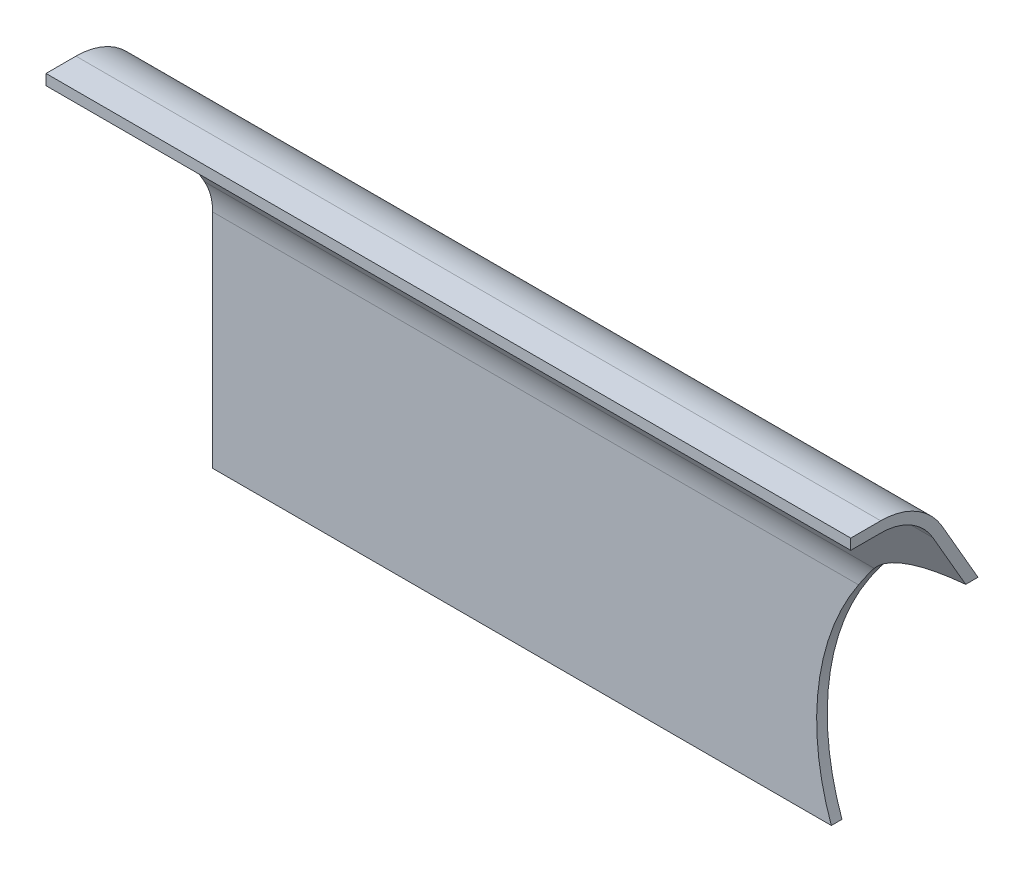
ISO-10303-21;
HEADER;
FILE_DESCRIPTION(('STEP AP214'),'2;1');
FILE_NAME('part.step','',(''),(''),'','','');
FILE_SCHEMA(('AUTOMOTIVE_DESIGN { 1 0 10303 214 1 1 1 1 }'));
ENDSEC;
DATA;
#1=APPLICATION_CONTEXT('core data for automotive mechanical design processes');
#2=APPLICATION_PROTOCOL_DEFINITION('international standard','automotive_design',2000,#1);
#3=PRODUCT_CONTEXT('',#1,'mechanical');
#4=PRODUCT('Part','Part','',(#3));
#5=PRODUCT_RELATED_PRODUCT_CATEGORY('part','',(#4));
#6=PRODUCT_DEFINITION_FORMATION('','',#4);
#7=PRODUCT_DEFINITION_CONTEXT('part definition',#1,'design');
#8=PRODUCT_DEFINITION('design','',#6,#7);
#9=PRODUCT_DEFINITION_SHAPE('','',#8);
#10=(LENGTH_UNIT() NAMED_UNIT(*) SI_UNIT(.MILLI.,.METRE.));
#11=(NAMED_UNIT(*) PLANE_ANGLE_UNIT() SI_UNIT($,.RADIAN.));
#12=(NAMED_UNIT(*) SI_UNIT($,.STERADIAN.) SOLID_ANGLE_UNIT());
#13=UNCERTAINTY_MEASURE_WITH_UNIT(LENGTH_MEASURE(1.E-05),#10,'distance_accuracy_value','');
#14=(GEOMETRIC_REPRESENTATION_CONTEXT(3) GLOBAL_UNCERTAINTY_ASSIGNED_CONTEXT((#13)) GLOBAL_UNIT_ASSIGNED_CONTEXT((#10,
#11,#12)) REPRESENTATION_CONTEXT('',''));
#15=CARTESIAN_POINT('',(0.,0.,0.));
#16=DIRECTION('',(0.,0.,1.));
#17=DIRECTION('',(1.,0.,0.));
#18=AXIS2_PLACEMENT_3D('',#15,#16,#17);
#19=CARTESIAN_POINT('',(113.5,68.,-3.));
#20=DIRECTION('',(0.,0.,1.));
#21=DIRECTION('',(0.,1.,0.));
#22=AXIS2_PLACEMENT_3D('',#19,#20,#21);
#23=PLANE('',#22);
#24=CARTESIAN_POINT('',(126.88,23.7215242270664,-3.));
#25=DIRECTION('',(0.,0.,1.));
#26=DIRECTION('',(1.,0.,0.));
#27=AXIS2_PLACEMENT_3D('',#24,#25,#26);
#28=CIRCLE('',#27,70.);
#29=CARTESIAN_POINT('',(68.6968998045525,62.6410161513776,-3.));
#30=VERTEX_POINT('',#29);
#31=CARTESIAN_POINT('',(61.0219003588419,0.,-3.));
#32=VERTEX_POINT('',#31);
#33=EDGE_CURVE('E163',#30,#32,#28,.T.);
#34=ORIENTED_EDGE('',*,*,#33,.T.);
#35=DIRECTION('',(-1.,0.,0.));
#36=VECTOR('',#35,1.);
#37=CARTESIAN_POINT('',(113.5,0.,-3.));
#38=LINE('',#37,#36);
#39=CARTESIAN_POINT('',(-113.5,0.,-3.));
#40=VERTEX_POINT('',#39);
#41=EDGE_CURVE('E305',#32,#40,#38,.T.);
#42=ORIENTED_EDGE('',*,*,#41,.T.);
#43=DIRECTION('',(0.,-1.,0.));
#44=VECTOR('',#43,1.);
#45=CARTESIAN_POINT('',(-113.5,68.,-3.));
#46=LINE('',#45,#44);
#47=CARTESIAN_POINT('',(-113.5,62.6410161513776,-3.));
#48=VERTEX_POINT('',#47);
#49=EDGE_CURVE('E168',#48,#40,#46,.T.);
#50=ORIENTED_EDGE('',*,*,#49,.F.);
#51=DIRECTION('',(-1.,0.,0.));
#52=VECTOR('',#51,1.);
#53=CARTESIAN_POINT('',(113.5,62.6410161513776,-3.));
#54=LINE('',#53,#52);
#55=EDGE_CURVE('E148',#30,#48,#54,.T.);
#56=ORIENTED_EDGE('',*,*,#55,.F.);
#57=EDGE_LOOP('',(#34,#42,#50,#56));
#58=FACE_BOUND('',#57,.T.);
#59=ADVANCED_FACE('F50',(#58),#23,.F.);
#60=CARTESIAN_POINT('',(113.5,0.,-3.));
#61=DIRECTION('',(0.,1.,0.));
#62=DIRECTION('',(0.,0.,-1.));
#63=AXIS2_PLACEMENT_3D('',#60,#61,#62);
#64=PLANE('',#63);
#65=DIRECTION('',(-1.,0.,0.));
#66=VECTOR('',#65,1.);
#67=CARTESIAN_POINT('',(113.5,0.,0.));
#68=LINE('',#67,#66);
#69=CARTESIAN_POINT('',(61.0219003588419,0.,0.));
#70=VERTEX_POINT('',#69);
#71=CARTESIAN_POINT('',(-113.5,0.,0.));
#72=VERTEX_POINT('',#71);
#73=EDGE_CURVE('E170',#70,#72,#68,.T.);
#74=ORIENTED_EDGE('',*,*,#73,.T.);
#75=DIRECTION('',(0.,0.,1.));
#76=VECTOR('',#75,1.);
#77=CARTESIAN_POINT('',(-113.5,0.,-3.));
#78=LINE('',#77,#76);
#79=EDGE_CURVE('E156',#40,#72,#78,.T.);
#80=ORIENTED_EDGE('',*,*,#79,.F.);
#81=ORIENTED_EDGE('',*,*,#41,.F.);
#82=DIRECTION('',(0.,0.,-1.));
#83=VECTOR('',#82,1.);
#84=CARTESIAN_POINT('',(61.0219003588419,0.,46.9999999999999));
#85=LINE('',#84,#83);
#86=EDGE_CURVE('E171',#70,#32,#85,.T.);
#87=ORIENTED_EDGE('',*,*,#86,.F.);
#88=EDGE_LOOP('',(#74,#80,#81,#87));
#89=FACE_BOUND('',#88,.T.);
#90=ADVANCED_FACE('F206',(#89),#64,.F.);
#91=CARTESIAN_POINT('',(113.5,0.,0.));
#92=DIRECTION('',(0.,0.,-1.));
#93=DIRECTION('',(1.,0.,0.));
#94=AXIS2_PLACEMENT_3D('',#91,#92,#93);
#95=PLANE('',#94);
#96=DIRECTION('',(-1.,0.,0.));
#97=VECTOR('',#96,1.);
#98=CARTESIAN_POINT('',(113.5,62.6410161513776,0.));
#99=LINE('',#98,#97);
#100=CARTESIAN_POINT('',(-113.5,62.6410161513776,0.));
#101=VERTEX_POINT('',#100);
#102=CARTESIAN_POINT('',(68.6968998045525,62.6410161513776,0.));
#103=VERTEX_POINT('',#102);
#104=EDGE_CURVE('E248',#101,#103,#99,.F.);
#105=ORIENTED_EDGE('',*,*,#104,.F.);
#106=DIRECTION('',(0.,1.,0.));
#107=VECTOR('',#106,1.);
#108=CARTESIAN_POINT('',(-113.5,0.,0.));
#109=LINE('',#108,#107);
#110=EDGE_CURVE('E252',#72,#101,#109,.T.);
#111=ORIENTED_EDGE('',*,*,#110,.F.);
#112=ORIENTED_EDGE('',*,*,#73,.F.);
#113=CARTESIAN_POINT('',(126.88,23.7215242270664,0.));
#114=DIRECTION('',(0.,0.,1.));
#115=DIRECTION('',(1.,0.,0.));
#116=AXIS2_PLACEMENT_3D('',#113,#114,#115);
#117=CIRCLE('',#116,70.);
#118=EDGE_CURVE('E177',#103,#70,#117,.T.);
#119=ORIENTED_EDGE('',*,*,#118,.F.);
#120=EDGE_LOOP('',(#105,#111,#112,#119));
#121=FACE_BOUND('',#120,.T.);
#122=ADVANCED_FACE('F221',(#121),#95,.F.);
#123=CARTESIAN_POINT('',(113.5,67.1961524227066,0.));
#124=DIRECTION('',(0.,0.499999999999998,-0.86602540378444));
#125=DIRECTION('',(0.,-0.86602540378444,-0.499999999999998));
#126=AXIS2_PLACEMENT_3D('',#123,#124,#125);
#127=PLANE('',#126);
#128=DIRECTION('',(0.,0.86602540378444,0.499999999999998));
#129=VECTOR('',#128,1.);
#130=CARTESIAN_POINT('',(113.5,67.1961524227066,0.));
#131=LINE('',#130,#129);
#132=CARTESIAN_POINT('',(113.5,92.4308802129873,14.5692768826454));
#133=VERTEX_POINT('',#132);
#134=CARTESIAN_POINT('',(113.5,108.461524227066,23.8245735194569));
#135=VERTEX_POINT('',#134);
#136=EDGE_CURVE('E196',#133,#135,#131,.T.);
#137=ORIENTED_EDGE('',*,*,#136,.T.);
#138=DIRECTION('',(-1.,0.,0.));
#139=VECTOR('',#138,1.);
#140=CARTESIAN_POINT('',(113.5,108.461524227066,23.8245735194569));
#141=LINE('',#140,#139);
#142=CARTESIAN_POINT('',(-113.5,108.461524227066,23.8245735194569));
#143=VERTEX_POINT('',#142);
#144=EDGE_CURVE('E270',#143,#135,#141,.F.);
#145=ORIENTED_EDGE('',*,*,#144,.F.);
#146=DIRECTION('',(0.,0.86602540378444,0.499999999999998));
#147=VECTOR('',#146,1.);
#148=CARTESIAN_POINT('',(-113.5,67.1961524227066,0.));
#149=LINE('',#148,#147);
#150=CARTESIAN_POINT('',(-113.5,71.1410161513775,2.27756813566452));
#151=VERTEX_POINT('',#150);
#152=EDGE_CURVE('E327',#151,#143,#149,.T.);
#153=ORIENTED_EDGE('',*,*,#152,.F.);
#154=DIRECTION('',(-1.,0.,0.));
#155=VECTOR('',#154,1.);
#156=CARTESIAN_POINT('',(-113.5,71.1410161513775,2.27756813566452));
#157=LINE('',#156,#155);
#158=CARTESIAN_POINT('',(75.3883328523907,71.1410161513775,2.27756813566452));
#159=VERTEX_POINT('',#158);
#160=EDGE_CURVE('E255',#159,#151,#157,.T.);
#161=ORIENTED_EDGE('',*,*,#160,.F.);
#162=CARTESIAN_POINT('',(126.88,23.7215242270664,-25.1000882916717));
#163=DIRECTION('',(0.,-0.499999999999998,0.86602540378444));
#164=DIRECTION('',(0.,-0.86602540378444,-0.499999999999998));
#165=AXIS2_PLACEMENT_3D('',#162,#163,#164);
#166=ELLIPSE('',#165,80.8290376865475,70.);
#167=EDGE_CURVE('E176',#133,#159,#166,.T.);
#168=ORIENTED_EDGE('',*,*,#167,.F.);
#169=EDGE_LOOP('',(#137,#145,#153,#161,#168));
#170=FACE_BOUND('',#169,.T.);
#171=ADVANCED_FACE('F241',(#170),#127,.F.);
#172=CARTESIAN_POINT('',(113.5,116.961524227066,28.7320508075687));
#173=DIRECTION('',(0.,1.,0.));
#174=DIRECTION('',(0.,0.,-1.));
#175=AXIS2_PLACEMENT_3D('',#172,#173,#174);
#176=PLANE('',#175);
#177=DIRECTION('',(0.,0.,1.));
#178=VECTOR('',#177,1.);
#179=CARTESIAN_POINT('',(113.5,116.961524227066,28.7320508075687));
#180=LINE('',#179,#178);
#181=CARTESIAN_POINT('',(113.5,116.961524227066,38.5470053837924));
#182=VERTEX_POINT('',#181);
#183=CARTESIAN_POINT('',(113.5,116.961524227066,46.9999999999999));
#184=VERTEX_POINT('',#183);
#185=EDGE_CURVE('E343',#182,#184,#180,.T.);
#186=ORIENTED_EDGE('',*,*,#185,.T.);
#187=DIRECTION('',(-1.,0.,0.));
#188=VECTOR('',#187,1.);
#189=CARTESIAN_POINT('',(113.5,116.961524227066,46.9999999999999));
#190=LINE('',#189,#188);
#191=CARTESIAN_POINT('',(-113.5,116.961524227066,46.9999999999999));
#192=VERTEX_POINT('',#191);
#193=EDGE_CURVE('E296',#184,#192,#190,.T.);
#194=ORIENTED_EDGE('',*,*,#193,.T.);
#195=DIRECTION('',(0.,0.,1.));
#196=VECTOR('',#195,1.);
#197=CARTESIAN_POINT('',(-113.5,116.961524227066,28.7320508075687));
#198=LINE('',#197,#196);
#199=CARTESIAN_POINT('',(-113.5,116.961524227066,38.5470053837924));
#200=VERTEX_POINT('',#199);
#201=EDGE_CURVE('E325',#200,#192,#198,.T.);
#202=ORIENTED_EDGE('',*,*,#201,.F.);
#203=DIRECTION('',(-1.,0.,0.));
#204=VECTOR('',#203,1.);
#205=CARTESIAN_POINT('',(-113.5,116.961524227066,38.5470053837924));
#206=LINE('',#205,#204);
#207=EDGE_CURVE('E271',#182,#200,#206,.T.);
#208=ORIENTED_EDGE('',*,*,#207,.F.);
#209=EDGE_LOOP('',(#186,#194,#202,#208));
#210=FACE_BOUND('',#209,.T.);
#211=ADVANCED_FACE('F240',(#210),#176,.F.);
#212=CARTESIAN_POINT('',(113.5,116.961524227066,46.9999999999999));
#213=DIRECTION('',(0.,0.,-1.));
#214=DIRECTION('',(0.,-1.,0.));
#215=AXIS2_PLACEMENT_3D('',#212,#213,#214);
#216=PLANE('',#215);
#217=DIRECTION('',(0.,1.,0.));
#218=VECTOR('',#217,1.);
#219=CARTESIAN_POINT('',(-113.5,116.961524227066,46.9999999999999));
#220=LINE('',#219,#218);
#221=CARTESIAN_POINT('',(-113.5,119.961524227066,46.9999999999999));
#222=VERTEX_POINT('',#221);
#223=EDGE_CURVE('E318',#192,#222,#220,.T.);
#224=ORIENTED_EDGE('',*,*,#223,.F.);
#225=ORIENTED_EDGE('',*,*,#193,.F.);
#226=DIRECTION('',(0.,1.,0.));
#227=VECTOR('',#226,1.);
#228=CARTESIAN_POINT('',(113.5,116.961524227066,46.9999999999999));
#229=LINE('',#228,#227);
#230=CARTESIAN_POINT('',(113.5,119.961524227066,46.9999999999999));
#231=VERTEX_POINT('',#230);
#232=EDGE_CURVE('E341',#184,#231,#229,.T.);
#233=ORIENTED_EDGE('',*,*,#232,.T.);
#234=DIRECTION('',(-1.,0.,0.));
#235=VECTOR('',#234,1.);
#236=CARTESIAN_POINT('',(113.5,119.961524227066,46.9999999999999));
#237=LINE('',#236,#235);
#238=EDGE_CURVE('E300',#231,#222,#237,.T.);
#239=ORIENTED_EDGE('',*,*,#238,.T.);
#240=EDGE_LOOP('',(#224,#225,#233,#239));
#241=FACE_BOUND('',#240,.T.);
#242=ADVANCED_FACE('F232',(#241),#216,.F.);
#243=CARTESIAN_POINT('',(113.5,119.961524227066,46.9999999999999));
#244=DIRECTION('',(0.,-1.,0.));
#245=DIRECTION('',(0.,0.,1.));
#246=AXIS2_PLACEMENT_3D('',#243,#244,#245);
#247=PLANE('',#246);
#248=DIRECTION('',(0.,0.,-1.));
#249=VECTOR('',#248,1.);
#250=CARTESIAN_POINT('',(-113.5,119.961524227066,46.9999999999999));
#251=LINE('',#250,#249);
#252=CARTESIAN_POINT('',(-113.5,119.961524227066,38.5470053837924));
#253=VERTEX_POINT('',#252);
#254=EDGE_CURVE('E312',#222,#253,#251,.T.);
#255=ORIENTED_EDGE('',*,*,#254,.F.);
#256=ORIENTED_EDGE('',*,*,#238,.F.);
#257=DIRECTION('',(0.,0.,-1.));
#258=VECTOR('',#257,1.);
#259=CARTESIAN_POINT('',(113.5,119.961524227066,46.9999999999999));
#260=LINE('',#259,#258);
#261=CARTESIAN_POINT('',(113.5,119.961524227066,38.5470053837924));
#262=VERTEX_POINT('',#261);
#263=EDGE_CURVE('E340',#231,#262,#260,.T.);
#264=ORIENTED_EDGE('',*,*,#263,.T.);
#265=DIRECTION('',(-1.,0.,0.));
#266=VECTOR('',#265,1.);
#267=CARTESIAN_POINT('',(113.5,119.961524227066,38.5470053837924));
#268=LINE('',#267,#266);
#269=EDGE_CURVE('E277',#253,#262,#268,.F.);
#270=ORIENTED_EDGE('',*,*,#269,.F.);
#271=EDGE_LOOP('',(#255,#256,#264,#270));
#272=FACE_BOUND('',#271,.T.);
#273=ADVANCED_FACE('F227',(#272),#247,.F.);
#274=CARTESIAN_POINT('',(113.5,119.961524227066,26.9999999999999));
#275=DIRECTION('',(0.,-0.499999999999998,0.86602540378444));
#276=DIRECTION('',(0.,0.86602540378444,0.499999999999998));
#277=AXIS2_PLACEMENT_3D('',#274,#275,#276);
#278=PLANE('',#277);
#279=DIRECTION('',(-1.,0.,0.));
#280=VECTOR('',#279,1.);
#281=CARTESIAN_POINT('',(113.5,72.6410161513775,-0.3205080756888));
#282=LINE('',#281,#280);
#283=CARTESIAN_POINT('',(-113.5,72.6410161513775,-0.320508075688803));
#284=VERTEX_POINT('',#283);
#285=CARTESIAN_POINT('',(76.811214216168,72.6410161513775,-0.3205080756888));
#286=VERTEX_POINT('',#285);
#287=EDGE_CURVE('E154',#284,#286,#282,.F.);
#288=ORIENTED_EDGE('',*,*,#287,.F.);
#289=DIRECTION('',(0.,-0.86602540378444,-0.499999999999998));
#290=VECTOR('',#289,1.);
#291=CARTESIAN_POINT('',(-113.5,119.961524227066,26.9999999999999));
#292=LINE('',#291,#290);
#293=CARTESIAN_POINT('',(-113.5,109.961524227066,21.2264973081036));
#294=VERTEX_POINT('',#293);
#295=EDGE_CURVE('E307',#294,#284,#292,.T.);
#296=ORIENTED_EDGE('',*,*,#295,.F.);
#297=DIRECTION('',(-1.,0.,0.));
#298=VECTOR('',#297,1.);
#299=CARTESIAN_POINT('',(113.5,109.961524227066,21.2264973081036));
#300=LINE('',#299,#298);
#301=CARTESIAN_POINT('',(113.5,109.961524227066,21.2264973081036));
#302=VERTEX_POINT('',#301);
#303=EDGE_CURVE('E283',#302,#294,#300,.T.);
#304=ORIENTED_EDGE('',*,*,#303,.F.);
#305=DIRECTION('',(0.,-0.86602540378444,-0.499999999999998));
#306=VECTOR('',#305,1.);
#307=CARTESIAN_POINT('',(113.5,119.961524227066,26.9999999999999));
#308=LINE('',#307,#306);
#309=CARTESIAN_POINT('',(113.5,92.4308802129873,11.1051752675076));
#310=VERTEX_POINT('',#309);
#311=EDGE_CURVE('E310',#302,#310,#308,.T.);
#312=ORIENTED_EDGE('',*,*,#311,.T.);
#313=CARTESIAN_POINT('',(126.88,23.7215242270664,-28.5641899068094));
#314=DIRECTION('',(0.,0.499999999999998,-0.86602540378444));
#315=DIRECTION('',(0.,-0.86602540378444,-0.499999999999998));
#316=AXIS2_PLACEMENT_3D('',#313,#314,#315);
#317=ELLIPSE('',#316,80.8290376865475,70.);
#318=EDGE_CURVE('E159',#286,#310,#317,.T.);
#319=ORIENTED_EDGE('',*,*,#318,.F.);
#320=EDGE_LOOP('',(#288,#296,#304,#312,#319));
#321=FACE_BOUND('',#320,.T.);
#322=ADVANCED_FACE('F224',(#321),#278,.F.);
#323=CARTESIAN_POINT('',(113.5,0.,0.));
#324=DIRECTION('',(1.,0.,0.));
#325=DIRECTION('',(0.,0.,1.));
#326=AXIS2_PLACEMENT_3D('',#323,#324,#325);
#327=PLANE('',#326);
#328=DIRECTION('',(0.,0.,-1.));
#329=VECTOR('',#328,1.);
#330=CARTESIAN_POINT('',(113.5,92.4308802129873,46.9999999999999));
#331=LINE('',#330,#329);
#332=EDGE_CURVE('E186',#133,#310,#331,.T.);
#333=ORIENTED_EDGE('',*,*,#332,.T.);
#334=ORIENTED_EDGE('',*,*,#311,.F.);
#335=CARTESIAN_POINT('',(113.5,99.9615242270664,38.5470053837924));
#336=DIRECTION('',(-1.,0.,0.));
#337=DIRECTION('',(0.,0.,1.));
#338=AXIS2_PLACEMENT_3D('',#335,#336,#337);
#339=CIRCLE('',#338,20.);
#340=EDGE_CURVE('E274',#262,#302,#339,.T.);
#341=ORIENTED_EDGE('',*,*,#340,.F.);
#342=ORIENTED_EDGE('',*,*,#263,.F.);
#343=ORIENTED_EDGE('',*,*,#232,.F.);
#344=ORIENTED_EDGE('',*,*,#185,.F.);
#345=CARTESIAN_POINT('',(113.5,99.9615242270664,38.5470053837924));
#346=DIRECTION('',(-1.,0.,0.));
#347=DIRECTION('',(0.,0.,1.));
#348=AXIS2_PLACEMENT_3D('',#345,#346,#347);
#349=CIRCLE('',#348,17.);
#350=EDGE_CURVE('E260',#135,#182,#349,.F.);
#351=ORIENTED_EDGE('',*,*,#350,.F.);
#352=ORIENTED_EDGE('',*,*,#136,.F.);
#353=EDGE_LOOP('',(#333,#334,#341,#342,#343,#344,#351,#352));
#354=FACE_BOUND('',#353,.T.);
#355=ADVANCED_FACE('F228',(#354),#327,.T.);
#356=CARTESIAN_POINT('',(-113.5,0.,0.));
#357=DIRECTION('',(1.,0.,0.));
#358=DIRECTION('',(0.,0.,1.));
#359=AXIS2_PLACEMENT_3D('',#356,#357,#358);
#360=PLANE('',#359);
#361=ORIENTED_EDGE('',*,*,#295,.T.);
#362=CARTESIAN_POINT('',(-113.5,62.6410161513776,17.));
#363=DIRECTION('',(-1.,0.,0.));
#364=DIRECTION('',(0.,0.,1.));
#365=AXIS2_PLACEMENT_3D('',#362,#363,#364);
#366=CIRCLE('',#365,20.);
#367=EDGE_CURVE('E166',#48,#284,#366,.F.);
#368=ORIENTED_EDGE('',*,*,#367,.F.);
#369=ORIENTED_EDGE('',*,*,#49,.T.);
#370=ORIENTED_EDGE('',*,*,#79,.T.);
#371=ORIENTED_EDGE('',*,*,#110,.T.);
#372=CARTESIAN_POINT('',(-113.5,62.6410161513776,17.));
#373=DIRECTION('',(-1.,0.,0.));
#374=DIRECTION('',(0.,0.,1.));
#375=AXIS2_PLACEMENT_3D('',#372,#373,#374);
#376=CIRCLE('',#375,17.);
#377=EDGE_CURVE('E62',#151,#101,#376,.T.);
#378=ORIENTED_EDGE('',*,*,#377,.F.);
#379=ORIENTED_EDGE('',*,*,#152,.T.);
#380=CARTESIAN_POINT('',(-113.5,99.9615242270664,38.5470053837924));
#381=DIRECTION('',(-1.,0.,0.));
#382=DIRECTION('',(0.,0.,1.));
#383=AXIS2_PLACEMENT_3D('',#380,#381,#382);
#384=CIRCLE('',#383,17.);
#385=EDGE_CURVE('E264',#200,#143,#384,.T.);
#386=ORIENTED_EDGE('',*,*,#385,.F.);
#387=ORIENTED_EDGE('',*,*,#201,.T.);
#388=ORIENTED_EDGE('',*,*,#223,.T.);
#389=ORIENTED_EDGE('',*,*,#254,.T.);
#390=CARTESIAN_POINT('',(-113.5,99.9615242270664,38.5470053837924));
#391=DIRECTION('',(-1.,0.,0.));
#392=DIRECTION('',(0.,0.,1.));
#393=AXIS2_PLACEMENT_3D('',#390,#391,#392);
#394=CIRCLE('',#393,20.);
#395=EDGE_CURVE('E285',#294,#253,#394,.F.);
#396=ORIENTED_EDGE('',*,*,#395,.F.);
#397=EDGE_LOOP('',(#361,#368,#369,#370,#371,#378,#379,#386,#387,#388,#389,#396));
#398=FACE_BOUND('',#397,.T.);
#399=ADVANCED_FACE('F203',(#398),#360,.F.);
#400=CARTESIAN_POINT('',(113.5,62.6410161513776,17.));
#401=DIRECTION('',(-1.,0.,0.));
#402=DIRECTION('',(0.,0.,-1.));
#403=AXIS2_PLACEMENT_3D('',#400,#401,#402);
#404=CYLINDRICAL_SURFACE('',#403,20.);
#405=CARTESIAN_POINT('',(76.811214216168,72.6410161513775,-0.3205080756888));
#406=CARTESIAN_POINT('',(76.5353860453912,72.3587144011366,-0.483484371223177));
#407=CARTESIAN_POINT('',(76.2600178696016,72.0720938615898,-0.639772857538327));
#408=CARTESIAN_POINT('',(75.7107290383817,71.4904008817577,-0.938657307110876));
#409=CARTESIAN_POINT('',(75.4368085039034,71.1953277480703,-1.08125214281995));
#410=CARTESIAN_POINT('',(74.8905924120409,70.5965280494253,-1.35260200822155));
#411=CARTESIAN_POINT('',(74.6182997860816,70.2927895596718,-1.4813366745724));
#412=CARTESIAN_POINT('',(74.0763056980685,69.6773515496672,-1.72430079726953));
#413=CARTESIAN_POINT('',(73.8066041624229,69.3656522564434,-1.83853066671224));
#414=CARTESIAN_POINT('',(73.0119527331018,68.4305165938836,-2.15488192652898));
#415=CARTESIAN_POINT('',(72.491348820214,67.7959784338889,-2.33569095672249));
#416=CARTESIAN_POINT('',(71.466576195374,66.5004195808116,-2.63533945741863));
#417=CARTESIAN_POINT('',(70.9623930186678,65.839423404953,-2.7542349310603));
#418=CARTESIAN_POINT('',(70.165715134435,64.7550616283522,-2.89228944079041));
#419=CARTESIAN_POINT('',(69.866916566096,64.3388962830907,-2.93224425905506));
#420=CARTESIAN_POINT('',(69.2761080509521,63.4966205278164,-2.98616905692302));
#421=CARTESIAN_POINT('',(68.9841456939194,63.0704673706929,-2.99999173888351));
#422=CARTESIAN_POINT('',(68.6968998045525,62.6410161513776,-3.));
#423=B_SPLINE_CURVE_WITH_KNOTS('',3,(#405,#406,#407,#408,#409,#410,#411,#412,#413,#414,#415,
#416,#417,#418,#419,#420,#421,#422),.UNSPECIFIED.,.F.,.F.,(4,2,2,2,2,2,2,2,4),(0.,
1.28095924371296,2.5620238725627,3.84494566918998,5.12783092002179,7.64631579233148,
10.1625186259356,11.7034236085578,13.2529885296787),.UNSPECIFIED.);
#424=EDGE_CURVE('E150',#286,#30,#423,.T.);
#425=ORIENTED_EDGE('',*,*,#424,.T.);
#426=ORIENTED_EDGE('',*,*,#55,.T.);
#427=ORIENTED_EDGE('',*,*,#367,.T.);
#428=ORIENTED_EDGE('',*,*,#287,.T.);
#429=EDGE_LOOP('',(#425,#426,#427,#428));
#430=FACE_BOUND('',#429,.T.);
#431=ADVANCED_FACE('F146',(#430),#404,.T.);
#432=CARTESIAN_POINT('',(113.5,99.9615242270664,38.5470053837924));
#433=DIRECTION('',(-1.,0.,0.));
#434=DIRECTION('',(0.,0.,-1.));
#435=AXIS2_PLACEMENT_3D('',#432,#433,#434);
#436=CYLINDRICAL_SURFACE('',#435,20.);
#437=ORIENTED_EDGE('',*,*,#340,.T.);
#438=ORIENTED_EDGE('',*,*,#303,.T.);
#439=ORIENTED_EDGE('',*,*,#395,.T.);
#440=ORIENTED_EDGE('',*,*,#269,.T.);
#441=EDGE_LOOP('',(#437,#438,#439,#440));
#442=FACE_BOUND('',#441,.T.);
#443=ADVANCED_FACE('F204',(#442),#436,.T.);
#444=CARTESIAN_POINT('',(113.5,99.9615242270664,38.5470053837924));
#445=DIRECTION('',(1.,0.,0.));
#446=DIRECTION('',(0.,0.,1.));
#447=AXIS2_PLACEMENT_3D('',#444,#445,#446);
#448=CYLINDRICAL_SURFACE('',#447,17.);
#449=ORIENTED_EDGE('',*,*,#350,.T.);
#450=ORIENTED_EDGE('',*,*,#207,.T.);
#451=ORIENTED_EDGE('',*,*,#385,.T.);
#452=ORIENTED_EDGE('',*,*,#144,.T.);
#453=EDGE_LOOP('',(#449,#450,#451,#452));
#454=FACE_BOUND('',#453,.T.);
#455=ADVANCED_FACE('F208',(#454),#448,.F.);
#456=CARTESIAN_POINT('',(113.5,62.6410161513776,17.));
#457=DIRECTION('',(1.,0.,0.));
#458=DIRECTION('',(0.,0.,1.));
#459=AXIS2_PLACEMENT_3D('',#456,#457,#458);
#460=CYLINDRICAL_SURFACE('',#459,17.);
#461=ORIENTED_EDGE('',*,*,#160,.T.);
#462=ORIENTED_EDGE('',*,*,#377,.T.);
#463=ORIENTED_EDGE('',*,*,#104,.T.);
#464=CARTESIAN_POINT('',(75.3883328523907,71.1410161513775,2.27756813566452));
#465=CARTESIAN_POINT('',(75.1618087856905,70.895041945746,2.13556618945438));
#466=CARTESIAN_POINT('',(74.9353062297323,70.6455475505589,1.99972832417409));
#467=CARTESIAN_POINT('',(74.4827813875734,70.1396956513,1.74055502429152));
#468=CARTESIAN_POINT('',(74.2567591284046,69.8833377714339,1.61722027604556));
#469=CARTESIAN_POINT('',(73.5796359089493,69.1037346154851,1.26601065527717));
#470=CARTESIAN_POINT('',(73.1299525896982,68.5704733560467,1.05722720544902));
#471=CARTESIAN_POINT('',(72.2464435393374,67.4896985264079,0.696349533525274));
#472=CARTESIAN_POINT('',(71.8124780989245,66.9426169977963,0.543298554253248));
#473=CARTESIAN_POINT('',(70.9557024900116,65.8281293323319,0.291672230765302));
#474=CARTESIAN_POINT('',(70.532883106012,65.2607409627042,0.193050447891501));
#475=CARTESIAN_POINT('',(69.8758892455746,64.3503522977741,0.082798652177461));
#476=CARTESIAN_POINT('',(69.6369469825516,64.0130110966015,0.0520320841115846));
#477=CARTESIAN_POINT('',(69.1632641926044,63.3315202029872,0.0105829185395504));
#478=CARTESIAN_POINT('',(68.9285525800785,62.9873439335133,7.42812352634912E-06));
#479=CARTESIAN_POINT('',(68.6968998045525,62.6410161513776,0.));
#480=B_SPLINE_CURVE_WITH_KNOTS('',3,(#464,#465,#466,#467,#468,#469,#470,#471,#472,#473,#474,
#475,#476,#477,#478,#479),.UNSPECIFIED.,.F.,.F.,(4,2,2,2,2,2,2,4),(0.,1.089725935989,
2.17951165992928,4.36135472139434,6.50374720046088,8.64430896638775,9.88740937422088,
11.1370858996161),.UNSPECIFIED.);
#481=EDGE_CURVE('E11',#159,#103,#480,.T.);
#482=ORIENTED_EDGE('',*,*,#481,.F.);
#483=EDGE_LOOP('',(#461,#462,#463,#482));
#484=FACE_BOUND('',#483,.T.);
#485=ADVANCED_FACE('F47',(#484),#460,.F.);
#486=CARTESIAN_POINT('',(126.88,23.7215242270664,46.9999999999999));
#487=DIRECTION('',(0.,0.,-1.));
#488=DIRECTION('',(1.,0.,0.));
#489=AXIS2_PLACEMENT_3D('',#486,#487,#488);
#490=CYLINDRICAL_SURFACE('',#489,70.);
#491=ORIENTED_EDGE('',*,*,#424,.F.);
#492=ORIENTED_EDGE('',*,*,#318,.T.);
#493=ORIENTED_EDGE('',*,*,#332,.F.);
#494=ORIENTED_EDGE('',*,*,#167,.T.);
#495=ORIENTED_EDGE('',*,*,#481,.T.);
#496=ORIENTED_EDGE('',*,*,#118,.T.);
#497=ORIENTED_EDGE('',*,*,#86,.T.);
#498=ORIENTED_EDGE('',*,*,#33,.F.);
#499=EDGE_LOOP('',(#491,#492,#493,#494,#495,#496,#497,#498));
#500=FACE_BOUND('',#499,.T.);
#501=ADVANCED_FACE('F173',(#500),#490,.F.);
#502=CLOSED_SHELL('',(#59,#90,#122,#171,#211,#242,#273,#322,#355,#399,#431,#443,#455,#485,#501));
#503=MANIFOLD_SOLID_BREP('B2',#502);
#504=ADVANCED_BREP_SHAPE_REPRESENTATION('',(#18,#503),#14);
#505=SHAPE_DEFINITION_REPRESENTATION(#9,#504);
ENDSEC;
END-ISO-10303-21;
